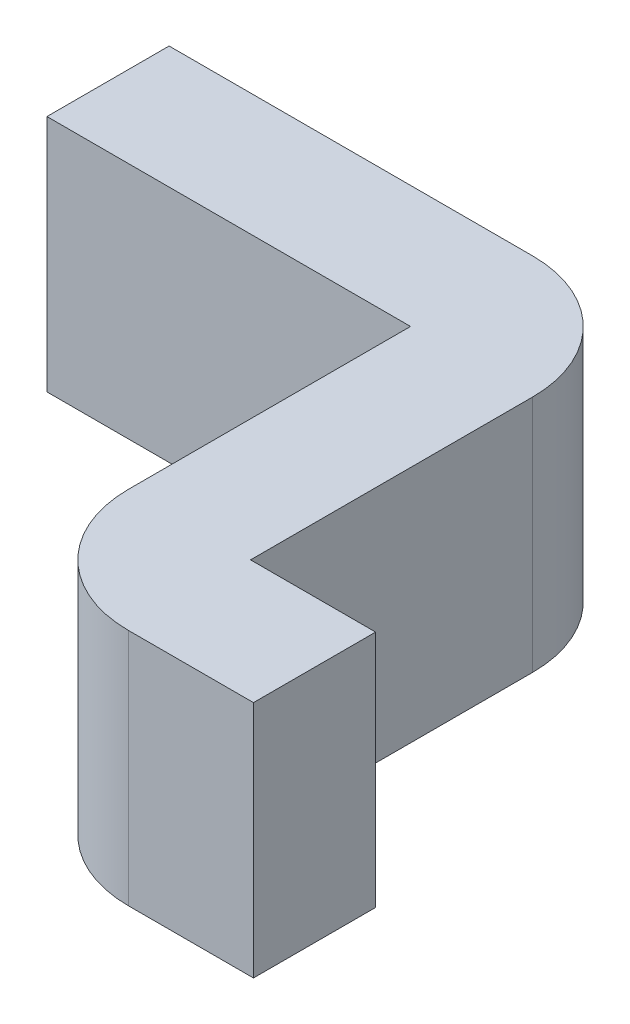
ISO-10303-21;
HEADER;
FILE_DESCRIPTION(('STEP AP214'),'2;1');
FILE_NAME('part.step','',(''),(''),'','','');
FILE_SCHEMA(('AUTOMOTIVE_DESIGN { 1 0 10303 214 1 1 1 1 }'));
ENDSEC;
DATA;
#1=APPLICATION_CONTEXT('core data for automotive mechanical design processes');
#2=APPLICATION_PROTOCOL_DEFINITION('international standard','automotive_design',2000,#1);
#3=PRODUCT_CONTEXT('',#1,'mechanical');
#4=PRODUCT('Part','Part','',(#3));
#5=PRODUCT_RELATED_PRODUCT_CATEGORY('part','',(#4));
#6=PRODUCT_DEFINITION_FORMATION('','',#4);
#7=PRODUCT_DEFINITION_CONTEXT('part definition',#1,'design');
#8=PRODUCT_DEFINITION('design','',#6,#7);
#9=PRODUCT_DEFINITION_SHAPE('','',#8);
#10=(LENGTH_UNIT() NAMED_UNIT(*) SI_UNIT(.MILLI.,.METRE.));
#11=(NAMED_UNIT(*) PLANE_ANGLE_UNIT() SI_UNIT($,.RADIAN.));
#12=(NAMED_UNIT(*) SI_UNIT($,.STERADIAN.) SOLID_ANGLE_UNIT());
#13=UNCERTAINTY_MEASURE_WITH_UNIT(LENGTH_MEASURE(1.E-05),#10,'distance_accuracy_value','');
#14=(GEOMETRIC_REPRESENTATION_CONTEXT(3) GLOBAL_UNCERTAINTY_ASSIGNED_CONTEXT((#13)) GLOBAL_UNIT_ASSIGNED_CONTEXT((#10,
#11,#12)) REPRESENTATION_CONTEXT('',''));
#15=CARTESIAN_POINT('',(0.,0.,0.));
#16=DIRECTION('',(0.,0.,1.));
#17=DIRECTION('',(1.,0.,0.));
#18=AXIS2_PLACEMENT_3D('',#15,#16,#17);
#19=CARTESIAN_POINT('',(-1.95,-1.7,0.905));
#20=DIRECTION('',(0.,1.,0.));
#21=DIRECTION('',(0.,0.,1.));
#22=AXIS2_PLACEMENT_3D('',#19,#20,#21);
#23=PLANE('',#22);
#24=CARTESIAN_POINT('',(-2.165,-1.7,0.695));
#25=DIRECTION('',(0.,-1.,0.));
#26=DIRECTION('',(0.,0.,-1.));
#27=AXIS2_PLACEMENT_3D('',#24,#25,#26);
#28=CIRCLE('',#27,0.21);
#29=CARTESIAN_POINT('',(-2.165,-1.7,0.905));
#30=VERTEX_POINT('',#29);
#31=CARTESIAN_POINT('',(-2.375,-1.7,0.695));
#32=VERTEX_POINT('',#31);
#33=EDGE_CURVE('E107',#30,#32,#28,.T.);
#34=ORIENTED_EDGE('',*,*,#33,.F.);
#35=DIRECTION('',(1.,0.,0.));
#36=VECTOR('',#35,1.);
#37=CARTESIAN_POINT('',(-1.95,-1.7,0.905));
#38=LINE('',#37,#36);
#39=CARTESIAN_POINT('',(-1.95,-1.7,0.905));
#40=VERTEX_POINT('',#39);
#41=EDGE_CURVE('E102',#40,#30,#38,.F.);
#42=ORIENTED_EDGE('',*,*,#41,.F.);
#43=DIRECTION('',(0.,0.,-1.));
#44=VECTOR('',#43,1.);
#45=CARTESIAN_POINT('',(-1.95,-1.7,0.695));
#46=LINE('',#45,#44);
#47=CARTESIAN_POINT('',(-1.95,-1.7,0.695));
#48=VERTEX_POINT('',#47);
#49=EDGE_CURVE('E90',#48,#40,#46,.F.);
#50=ORIENTED_EDGE('',*,*,#49,.F.);
#51=DIRECTION('',(-1.,0.,0.));
#52=VECTOR('',#51,1.);
#53=CARTESIAN_POINT('',(-2.165,-1.7,0.695));
#54=LINE('',#53,#52);
#55=CARTESIAN_POINT('',(-2.165,-1.7,0.695));
#56=VERTEX_POINT('',#55);
#57=EDGE_CURVE('E99',#56,#48,#54,.F.);
#58=ORIENTED_EDGE('',*,*,#57,.F.);
#59=DIRECTION('',(0.,0.,-1.));
#60=VECTOR('',#59,1.);
#61=CARTESIAN_POINT('',(-2.165,-1.7,0.21));
#62=LINE('',#61,#60);
#63=CARTESIAN_POINT('',(-2.165,-1.7,0.21));
#64=VERTEX_POINT('',#63);
#65=EDGE_CURVE('E78',#64,#56,#62,.F.);
#66=ORIENTED_EDGE('',*,*,#65,.F.);
#67=CARTESIAN_POINT('',(-2.375,-1.7,0.21));
#68=DIRECTION('',(0.,-1.,0.));
#69=DIRECTION('',(0.,0.,-1.));
#70=AXIS2_PLACEMENT_3D('',#67,#68,#69);
#71=CIRCLE('',#70,0.21);
#72=CARTESIAN_POINT('',(-2.375,-1.7,0.));
#73=VERTEX_POINT('',#72);
#74=EDGE_CURVE('E20',#73,#64,#71,.T.);
#75=ORIENTED_EDGE('',*,*,#74,.F.);
#76=DIRECTION('',(-1.,0.,0.));
#77=VECTOR('',#76,1.);
#78=CARTESIAN_POINT('',(-3.,-1.7,0.));
#79=LINE('',#78,#77);
#80=CARTESIAN_POINT('',(-3.,-1.7,0.));
#81=VERTEX_POINT('',#80);
#82=EDGE_CURVE('E62',#81,#73,#79,.F.);
#83=ORIENTED_EDGE('',*,*,#82,.F.);
#84=DIRECTION('',(0.,0.,1.));
#85=VECTOR('',#84,1.);
#86=CARTESIAN_POINT('',(-3.,-1.7,0.21));
#87=LINE('',#86,#85);
#88=CARTESIAN_POINT('',(-3.,-1.7,0.21));
#89=VERTEX_POINT('',#88);
#90=EDGE_CURVE('E132',#89,#81,#87,.F.);
#91=ORIENTED_EDGE('',*,*,#90,.F.);
#92=DIRECTION('',(1.,0.,0.));
#93=VECTOR('',#92,1.);
#94=CARTESIAN_POINT('',(-2.375,-1.7,0.21));
#95=LINE('',#94,#93);
#96=CARTESIAN_POINT('',(-2.375,-1.7,0.21));
#97=VERTEX_POINT('',#96);
#98=EDGE_CURVE('E126',#97,#89,#95,.F.);
#99=ORIENTED_EDGE('',*,*,#98,.F.);
#100=DIRECTION('',(0.,0.,1.));
#101=VECTOR('',#100,1.);
#102=CARTESIAN_POINT('',(-2.375,-1.7,0.695));
#103=LINE('',#102,#101);
#104=EDGE_CURVE('E119',#32,#97,#103,.F.);
#105=ORIENTED_EDGE('',*,*,#104,.F.);
#106=EDGE_LOOP('',(#34,#42,#50,#58,#66,#75,#83,#91,#99,#105));
#107=FACE_BOUND('',#106,.T.);
#108=ADVANCED_FACE('F17',(#107),#23,.T.);
#109=CARTESIAN_POINT('',(-1.95,-2.11,0.695));
#110=DIRECTION('',(1.,0.,0.));
#111=DIRECTION('',(0.,0.,-1.));
#112=AXIS2_PLACEMENT_3D('',#109,#110,#111);
#113=PLANE('',#112);
#114=DIRECTION('',(0.,1.,0.));
#115=VECTOR('',#114,1.);
#116=CARTESIAN_POINT('',(-1.95,-2.11,0.905));
#117=LINE('',#116,#115);
#118=CARTESIAN_POINT('',(-1.95,-2.11,0.905));
#119=VERTEX_POINT('',#118);
#120=EDGE_CURVE('E94',#119,#40,#117,.T.);
#121=ORIENTED_EDGE('',*,*,#120,.F.);
#122=DIRECTION('',(0.,0.,1.));
#123=VECTOR('',#122,1.);
#124=CARTESIAN_POINT('',(-1.95,-2.11,0.905));
#125=LINE('',#124,#123);
#126=CARTESIAN_POINT('',(-1.95,-2.11,0.695));
#127=VERTEX_POINT('',#126);
#128=EDGE_CURVE('E109',#119,#127,#125,.F.);
#129=ORIENTED_EDGE('',*,*,#128,.T.);
#130=DIRECTION('',(0.,1.,0.));
#131=VECTOR('',#130,1.);
#132=CARTESIAN_POINT('',(-1.95,-2.11,0.695));
#133=LINE('',#132,#131);
#134=EDGE_CURVE('E96',#48,#127,#133,.F.);
#135=ORIENTED_EDGE('',*,*,#134,.F.);
#136=ORIENTED_EDGE('',*,*,#49,.T.);
#137=EDGE_LOOP('',(#121,#129,#135,#136));
#138=FACE_BOUND('',#137,.T.);
#139=ADVANCED_FACE('F92',(#138),#113,.T.);
#140=CARTESIAN_POINT('',(-2.165,-2.11,0.695));
#141=DIRECTION('',(0.,0.,-1.));
#142=DIRECTION('',(-1.,0.,0.));
#143=AXIS2_PLACEMENT_3D('',#140,#141,#142);
#144=PLANE('',#143);
#145=ORIENTED_EDGE('',*,*,#134,.T.);
#146=DIRECTION('',(1.,0.,0.));
#147=VECTOR('',#146,1.);
#148=CARTESIAN_POINT('',(-1.95,-2.11,0.695));
#149=LINE('',#148,#147);
#150=CARTESIAN_POINT('',(-2.165,-2.11,0.695));
#151=VERTEX_POINT('',#150);
#152=EDGE_CURVE('E190',#127,#151,#149,.F.);
#153=ORIENTED_EDGE('',*,*,#152,.T.);
#154=DIRECTION('',(0.,1.,0.));
#155=VECTOR('',#154,1.);
#156=CARTESIAN_POINT('',(-2.165,-2.11,0.695));
#157=LINE('',#156,#155);
#158=EDGE_CURVE('E142',#56,#151,#157,.F.);
#159=ORIENTED_EDGE('',*,*,#158,.F.);
#160=ORIENTED_EDGE('',*,*,#57,.T.);
#161=EDGE_LOOP('',(#145,#153,#159,#160));
#162=FACE_BOUND('',#161,.T.);
#163=ADVANCED_FACE('F196',(#162),#144,.T.);
#164=CARTESIAN_POINT('',(-2.165,-2.11,0.21));
#165=DIRECTION('',(1.,0.,0.));
#166=DIRECTION('',(0.,0.,-1.));
#167=AXIS2_PLACEMENT_3D('',#164,#165,#166);
#168=PLANE('',#167);
#169=ORIENTED_EDGE('',*,*,#158,.T.);
#170=DIRECTION('',(0.,0.,1.));
#171=VECTOR('',#170,1.);
#172=CARTESIAN_POINT('',(-2.165,-2.11,0.905));
#173=LINE('',#172,#171);
#174=CARTESIAN_POINT('',(-2.165,-2.11,0.21));
#175=VERTEX_POINT('',#174);
#176=EDGE_CURVE('E154',#151,#175,#173,.F.);
#177=ORIENTED_EDGE('',*,*,#176,.T.);
#178=DIRECTION('',(0.,-1.,0.));
#179=VECTOR('',#178,1.);
#180=CARTESIAN_POINT('',(-2.165,-2.11,0.21));
#181=LINE('',#180,#179);
#182=EDGE_CURVE('E138',#64,#175,#181,.T.);
#183=ORIENTED_EDGE('',*,*,#182,.F.);
#184=ORIENTED_EDGE('',*,*,#65,.T.);
#185=EDGE_LOOP('',(#169,#177,#183,#184));
#186=FACE_BOUND('',#185,.T.);
#187=ADVANCED_FACE('F238',(#186),#168,.T.);
#188=CARTESIAN_POINT('',(-2.375,-2.11,0.21));
#189=DIRECTION('',(0.,-1.,0.));
#190=DIRECTION('',(0.,0.,-1.));
#191=AXIS2_PLACEMENT_3D('',#188,#189,#190);
#192=CYLINDRICAL_SURFACE('',#191,0.21);
#193=ORIENTED_EDGE('',*,*,#182,.T.);
#194=CARTESIAN_POINT('',(-2.375,-2.11,0.21));
#195=DIRECTION('',(0.,-1.,0.));
#196=DIRECTION('',(0.,0.,-1.));
#197=AXIS2_PLACEMENT_3D('',#194,#195,#196);
#198=CIRCLE('',#197,0.21);
#199=CARTESIAN_POINT('',(-2.375,-2.11,0.));
#200=VERTEX_POINT('',#199);
#201=EDGE_CURVE('E151',#175,#200,#198,.F.);
#202=ORIENTED_EDGE('',*,*,#201,.T.);
#203=DIRECTION('',(0.,1.,0.));
#204=VECTOR('',#203,1.);
#205=CARTESIAN_POINT('',(-2.375,-2.11,0.));
#206=LINE('',#205,#204);
#207=EDGE_CURVE('E134',#73,#200,#206,.F.);
#208=ORIENTED_EDGE('',*,*,#207,.F.);
#209=ORIENTED_EDGE('',*,*,#74,.T.);
#210=EDGE_LOOP('',(#193,#202,#208,#209));
#211=FACE_BOUND('',#210,.T.);
#212=ADVANCED_FACE('F239',(#211),#192,.T.);
#213=CARTESIAN_POINT('',(-3.,-2.11,0.));
#214=DIRECTION('',(0.,0.,-1.));
#215=DIRECTION('',(-1.,0.,0.));
#216=AXIS2_PLACEMENT_3D('',#213,#214,#215);
#217=PLANE('',#216);
#218=ORIENTED_EDGE('',*,*,#207,.T.);
#219=DIRECTION('',(1.,0.,0.));
#220=VECTOR('',#219,1.);
#221=CARTESIAN_POINT('',(-1.95,-2.11,0.));
#222=LINE('',#221,#220);
#223=CARTESIAN_POINT('',(-3.,-2.11,0.));
#224=VERTEX_POINT('',#223);
#225=EDGE_CURVE('E153',#200,#224,#222,.F.);
#226=ORIENTED_EDGE('',*,*,#225,.T.);
#227=DIRECTION('',(0.,1.,0.));
#228=VECTOR('',#227,1.);
#229=CARTESIAN_POINT('',(-3.,-2.11,0.));
#230=LINE('',#229,#228);
#231=EDGE_CURVE('E129',#81,#224,#230,.F.);
#232=ORIENTED_EDGE('',*,*,#231,.F.);
#233=ORIENTED_EDGE('',*,*,#82,.T.);
#234=EDGE_LOOP('',(#218,#226,#232,#233));
#235=FACE_BOUND('',#234,.T.);
#236=ADVANCED_FACE('F241',(#235),#217,.T.);
#237=CARTESIAN_POINT('',(-3.,-2.11,0.21));
#238=DIRECTION('',(-1.,0.,0.));
#239=DIRECTION('',(0.,0.,1.));
#240=AXIS2_PLACEMENT_3D('',#237,#238,#239);
#241=PLANE('',#240);
#242=ORIENTED_EDGE('',*,*,#231,.T.);
#243=DIRECTION('',(0.,0.,1.));
#244=VECTOR('',#243,1.);
#245=CARTESIAN_POINT('',(-3.,-2.11,0.905));
#246=LINE('',#245,#244);
#247=CARTESIAN_POINT('',(-3.,-2.11,0.21));
#248=VERTEX_POINT('',#247);
#249=EDGE_CURVE('E170',#224,#248,#246,.T.);
#250=ORIENTED_EDGE('',*,*,#249,.T.);
#251=DIRECTION('',(0.,1.,0.));
#252=VECTOR('',#251,1.);
#253=CARTESIAN_POINT('',(-3.,-2.11,0.21));
#254=LINE('',#253,#252);
#255=EDGE_CURVE('E123',#89,#248,#254,.F.);
#256=ORIENTED_EDGE('',*,*,#255,.F.);
#257=ORIENTED_EDGE('',*,*,#90,.T.);
#258=EDGE_LOOP('',(#242,#250,#256,#257));
#259=FACE_BOUND('',#258,.T.);
#260=ADVANCED_FACE('F234',(#259),#241,.T.);
#261=CARTESIAN_POINT('',(-2.375,-2.11,0.21));
#262=DIRECTION('',(0.,0.,1.));
#263=DIRECTION('',(1.,0.,0.));
#264=AXIS2_PLACEMENT_3D('',#261,#262,#263);
#265=PLANE('',#264);
#266=ORIENTED_EDGE('',*,*,#255,.T.);
#267=DIRECTION('',(1.,0.,0.));
#268=VECTOR('',#267,1.);
#269=CARTESIAN_POINT('',(-1.95,-2.11,0.21));
#270=LINE('',#269,#268);
#271=CARTESIAN_POINT('',(-2.375,-2.11,0.21));
#272=VERTEX_POINT('',#271);
#273=EDGE_CURVE('E167',#248,#272,#270,.T.);
#274=ORIENTED_EDGE('',*,*,#273,.T.);
#275=DIRECTION('',(0.,1.,0.));
#276=VECTOR('',#275,1.);
#277=CARTESIAN_POINT('',(-2.375,-2.11,0.21));
#278=LINE('',#277,#276);
#279=EDGE_CURVE('E122',#97,#272,#278,.F.);
#280=ORIENTED_EDGE('',*,*,#279,.F.);
#281=ORIENTED_EDGE('',*,*,#98,.T.);
#282=EDGE_LOOP('',(#266,#274,#280,#281));
#283=FACE_BOUND('',#282,.T.);
#284=ADVANCED_FACE('F228',(#283),#265,.T.);
#285=CARTESIAN_POINT('',(-2.375,-2.11,0.695));
#286=DIRECTION('',(-1.,0.,0.));
#287=DIRECTION('',(0.,0.,1.));
#288=AXIS2_PLACEMENT_3D('',#285,#286,#287);
#289=PLANE('',#288);
#290=ORIENTED_EDGE('',*,*,#279,.T.);
#291=DIRECTION('',(0.,0.,1.));
#292=VECTOR('',#291,1.);
#293=CARTESIAN_POINT('',(-2.375,-2.11,0.905));
#294=LINE('',#293,#292);
#295=CARTESIAN_POINT('',(-2.375,-2.11,0.695));
#296=VERTEX_POINT('',#295);
#297=EDGE_CURVE('E150',#272,#296,#294,.T.);
#298=ORIENTED_EDGE('',*,*,#297,.T.);
#299=DIRECTION('',(0.,-1.,0.));
#300=VECTOR('',#299,1.);
#301=CARTESIAN_POINT('',(-2.375,-2.11,0.695));
#302=LINE('',#301,#300);
#303=EDGE_CURVE('E104',#32,#296,#302,.T.);
#304=ORIENTED_EDGE('',*,*,#303,.F.);
#305=ORIENTED_EDGE('',*,*,#104,.T.);
#306=EDGE_LOOP('',(#290,#298,#304,#305));
#307=FACE_BOUND('',#306,.T.);
#308=ADVANCED_FACE('F222',(#307),#289,.T.);
#309=CARTESIAN_POINT('',(-2.165,-2.11,0.695));
#310=DIRECTION('',(0.,-1.,0.));
#311=DIRECTION('',(0.,0.,-1.));
#312=AXIS2_PLACEMENT_3D('',#309,#310,#311);
#313=CYLINDRICAL_SURFACE('',#312,0.21);
#314=ORIENTED_EDGE('',*,*,#303,.T.);
#315=CARTESIAN_POINT('',(-2.165,-2.11,0.695));
#316=DIRECTION('',(0.,-1.,0.));
#317=DIRECTION('',(0.,0.,-1.));
#318=AXIS2_PLACEMENT_3D('',#315,#316,#317);
#319=CIRCLE('',#318,0.21);
#320=CARTESIAN_POINT('',(-2.165,-2.11,0.905));
#321=VERTEX_POINT('',#320);
#322=EDGE_CURVE('E26',#296,#321,#319,.F.);
#323=ORIENTED_EDGE('',*,*,#322,.T.);
#324=DIRECTION('',(0.,1.,0.));
#325=VECTOR('',#324,1.);
#326=CARTESIAN_POINT('',(-2.165,-2.11,0.905));
#327=LINE('',#326,#325);
#328=EDGE_CURVE('E34',#30,#321,#327,.F.);
#329=ORIENTED_EDGE('',*,*,#328,.F.);
#330=ORIENTED_EDGE('',*,*,#33,.T.);
#331=EDGE_LOOP('',(#314,#323,#329,#330));
#332=FACE_BOUND('',#331,.T.);
#333=ADVANCED_FACE('F256',(#332),#313,.T.);
#334=CARTESIAN_POINT('',(-1.95,-2.11,0.905));
#335=DIRECTION('',(0.,0.,1.));
#336=DIRECTION('',(1.,0.,0.));
#337=AXIS2_PLACEMENT_3D('',#334,#335,#336);
#338=PLANE('',#337);
#339=ORIENTED_EDGE('',*,*,#328,.T.);
#340=DIRECTION('',(1.,0.,0.));
#341=VECTOR('',#340,1.);
#342=CARTESIAN_POINT('',(-1.95,-2.11,0.905));
#343=LINE('',#342,#341);
#344=EDGE_CURVE('E11',#321,#119,#343,.T.);
#345=ORIENTED_EDGE('',*,*,#344,.T.);
#346=ORIENTED_EDGE('',*,*,#120,.T.);
#347=ORIENTED_EDGE('',*,*,#41,.T.);
#348=EDGE_LOOP('',(#339,#345,#346,#347));
#349=FACE_BOUND('',#348,.T.);
#350=ADVANCED_FACE('F101',(#349),#338,.T.);
#351=CARTESIAN_POINT('',(-1.95,-2.11,0.905));
#352=DIRECTION('',(0.,1.,0.));
#353=DIRECTION('',(0.,0.,1.));
#354=AXIS2_PLACEMENT_3D('',#351,#352,#353);
#355=PLANE('',#354);
#356=ORIENTED_EDGE('',*,*,#322,.F.);
#357=ORIENTED_EDGE('',*,*,#297,.F.);
#358=ORIENTED_EDGE('',*,*,#273,.F.);
#359=ORIENTED_EDGE('',*,*,#249,.F.);
#360=ORIENTED_EDGE('',*,*,#225,.F.);
#361=ORIENTED_EDGE('',*,*,#201,.F.);
#362=ORIENTED_EDGE('',*,*,#176,.F.);
#363=ORIENTED_EDGE('',*,*,#152,.F.);
#364=ORIENTED_EDGE('',*,*,#128,.F.);
#365=ORIENTED_EDGE('',*,*,#344,.F.);
#366=EDGE_LOOP('',(#356,#357,#358,#359,#360,#361,#362,#363,#364,#365));
#367=FACE_BOUND('',#366,.T.);
#368=ADVANCED_FACE('F202',(#367),#355,.F.);
#369=CLOSED_SHELL('',(#108,#139,#163,#187,#212,#236,#260,#284,#308,#333,#350,#368));
#370=MANIFOLD_SOLID_BREP('B1',#369);
#371=ADVANCED_BREP_SHAPE_REPRESENTATION('',(#18,#370),#14);
#372=SHAPE_DEFINITION_REPRESENTATION(#9,#371);
ENDSEC;
END-ISO-10303-21;
